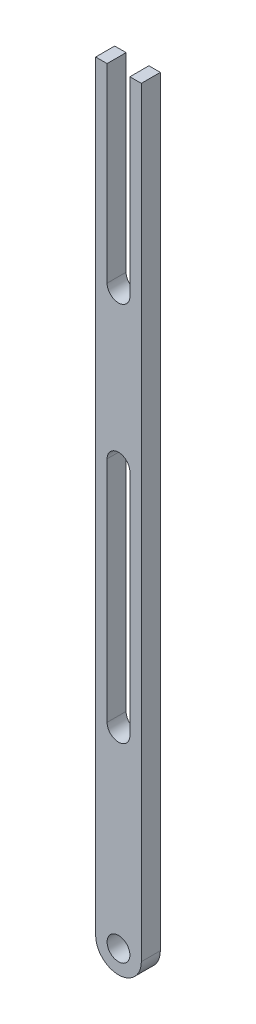
ISO-10303-21;
HEADER;
FILE_DESCRIPTION(('STEP AP214'),'2;1');
FILE_NAME('part.step','',(''),(''),'','','');
FILE_SCHEMA(('AUTOMOTIVE_DESIGN { 1 0 10303 214 1 1 1 1 }'));
ENDSEC;
DATA;
#1=APPLICATION_CONTEXT('core data for automotive mechanical design processes');
#2=APPLICATION_PROTOCOL_DEFINITION('international standard','automotive_design',2000,#1);
#3=PRODUCT_CONTEXT('',#1,'mechanical');
#4=PRODUCT('Part','Part','',(#3));
#5=PRODUCT_RELATED_PRODUCT_CATEGORY('part','',(#4));
#6=PRODUCT_DEFINITION_FORMATION('','',#4);
#7=PRODUCT_DEFINITION_CONTEXT('part definition',#1,'design');
#8=PRODUCT_DEFINITION('design','',#6,#7);
#9=PRODUCT_DEFINITION_SHAPE('','',#8);
#10=(LENGTH_UNIT() NAMED_UNIT(*) SI_UNIT(.MILLI.,.METRE.));
#11=(NAMED_UNIT(*) PLANE_ANGLE_UNIT() SI_UNIT($,.RADIAN.));
#12=(NAMED_UNIT(*) SI_UNIT($,.STERADIAN.) SOLID_ANGLE_UNIT());
#13=UNCERTAINTY_MEASURE_WITH_UNIT(LENGTH_MEASURE(1.E-05),#10,'distance_accuracy_value','');
#14=(GEOMETRIC_REPRESENTATION_CONTEXT(3) GLOBAL_UNCERTAINTY_ASSIGNED_CONTEXT((#13)) GLOBAL_UNIT_ASSIGNED_CONTEXT((#10,
#11,#12)) REPRESENTATION_CONTEXT('',''));
#15=CARTESIAN_POINT('',(0.,0.,0.));
#16=DIRECTION('',(0.,0.,1.));
#17=DIRECTION('',(1.,0.,0.));
#18=AXIS2_PLACEMENT_3D('',#15,#16,#17);
#19=CARTESIAN_POINT('',(-0.599999999999999,192.,5.));
#20=DIRECTION('',(0.,-1.,0.));
#21=DIRECTION('',(0.,0.,-1.));
#22=AXIS2_PLACEMENT_3D('',#19,#20,#21);
#23=PLANE('',#22);
#24=DIRECTION('',(-1.,0.,0.));
#25=VECTOR('',#24,1.);
#26=CARTESIAN_POINT('',(-0.599999999999999,192.,0.));
#27=LINE('',#26,#25);
#28=CARTESIAN_POINT('',(11.4,192.,0.));
#29=VERTEX_POINT('',#28);
#30=CARTESIAN_POINT('',(8.4,192.,0.));
#31=VERTEX_POINT('',#30);
#32=EDGE_CURVE('E157',#29,#31,#27,.T.);
#33=ORIENTED_EDGE('',*,*,#32,.T.);
#34=DIRECTION('',(0.,0.,1.));
#35=VECTOR('',#34,1.);
#36=CARTESIAN_POINT('',(8.4,192.,0.));
#37=LINE('',#36,#35);
#38=CARTESIAN_POINT('',(8.4,192.,5.));
#39=VERTEX_POINT('',#38);
#40=EDGE_CURVE('E203',#31,#39,#37,.T.);
#41=ORIENTED_EDGE('',*,*,#40,.T.);
#42=DIRECTION('',(-1.,0.,0.));
#43=VECTOR('',#42,1.);
#44=CARTESIAN_POINT('',(-0.599999999999999,192.,5.));
#45=LINE('',#44,#43);
#46=CARTESIAN_POINT('',(11.4,192.,5.));
#47=VERTEX_POINT('',#46);
#48=EDGE_CURVE('E185',#47,#39,#45,.T.);
#49=ORIENTED_EDGE('',*,*,#48,.F.);
#50=DIRECTION('',(0.,0.,-1.));
#51=VECTOR('',#50,1.);
#52=CARTESIAN_POINT('',(11.4,192.,5.));
#53=LINE('',#52,#51);
#54=EDGE_CURVE('E48',#47,#29,#53,.T.);
#55=ORIENTED_EDGE('',*,*,#54,.T.);
#56=EDGE_LOOP('',(#33,#41,#49,#55));
#57=FACE_BOUND('',#56,.T.);
#58=ADVANCED_FACE('F39',(#57),#23,.F.);
#59=CARTESIAN_POINT('',(5.4,-8.,5.));
#60=DIRECTION('',(0.,0.,-1.));
#61=DIRECTION('',(-1.,0.,0.));
#62=AXIS2_PLACEMENT_3D('',#59,#60,#61);
#63=CYLINDRICAL_SURFACE('',#62,6.);
#64=CARTESIAN_POINT('',(5.4,-8.,0.));
#65=DIRECTION('',(0.,0.,1.));
#66=DIRECTION('',(-1.,0.,0.));
#67=AXIS2_PLACEMENT_3D('',#64,#65,#66);
#68=CIRCLE('',#67,6.);
#69=CARTESIAN_POINT('',(-0.599999999999999,-8.,0.));
#70=VERTEX_POINT('',#69);
#71=CARTESIAN_POINT('',(11.4,-8.,0.));
#72=VERTEX_POINT('',#71);
#73=EDGE_CURVE('E163',#70,#72,#68,.T.);
#74=ORIENTED_EDGE('',*,*,#73,.T.);
#75=DIRECTION('',(0.,0.,-1.));
#76=VECTOR('',#75,1.);
#77=CARTESIAN_POINT('',(11.4,-8.,5.));
#78=LINE('',#77,#76);
#79=CARTESIAN_POINT('',(11.4,-8.,5.));
#80=VERTEX_POINT('',#79);
#81=EDGE_CURVE('E11',#80,#72,#78,.T.);
#82=ORIENTED_EDGE('',*,*,#81,.F.);
#83=CARTESIAN_POINT('',(5.4,-8.,5.));
#84=DIRECTION('',(0.,0.,1.));
#85=DIRECTION('',(-1.,0.,0.));
#86=AXIS2_PLACEMENT_3D('',#83,#84,#85);
#87=CIRCLE('',#86,6.);
#88=CARTESIAN_POINT('',(-0.599999999999999,-8.,5.));
#89=VERTEX_POINT('',#88);
#90=EDGE_CURVE('E169',#89,#80,#87,.T.);
#91=ORIENTED_EDGE('',*,*,#90,.F.);
#92=DIRECTION('',(0.,0.,-1.));
#93=VECTOR('',#92,1.);
#94=CARTESIAN_POINT('',(-0.599999999999999,-8.,5.));
#95=LINE('',#94,#93);
#96=EDGE_CURVE('E170',#89,#70,#95,.T.);
#97=ORIENTED_EDGE('',*,*,#96,.T.);
#98=EDGE_LOOP('',(#74,#82,#91,#97));
#99=FACE_BOUND('',#98,.T.);
#100=ADVANCED_FACE('F41',(#99),#63,.T.);
#101=CARTESIAN_POINT('',(11.4,192.,5.));
#102=DIRECTION('',(-1.,0.,0.));
#103=DIRECTION('',(0.,-1.,0.));
#104=AXIS2_PLACEMENT_3D('',#101,#102,#103);
#105=PLANE('',#104);
#106=DIRECTION('',(0.,1.,0.));
#107=VECTOR('',#106,1.);
#108=CARTESIAN_POINT('',(11.4,192.,0.));
#109=LINE('',#108,#107);
#110=EDGE_CURVE('E158',#72,#29,#109,.T.);
#111=ORIENTED_EDGE('',*,*,#110,.T.);
#112=ORIENTED_EDGE('',*,*,#54,.F.);
#113=DIRECTION('',(0.,1.,0.));
#114=VECTOR('',#113,1.);
#115=CARTESIAN_POINT('',(11.4,192.,5.));
#116=LINE('',#115,#114);
#117=EDGE_CURVE('E264',#80,#47,#116,.T.);
#118=ORIENTED_EDGE('',*,*,#117,.F.);
#119=ORIENTED_EDGE('',*,*,#81,.T.);
#120=EDGE_LOOP('',(#111,#112,#118,#119));
#121=FACE_BOUND('',#120,.T.);
#122=ADVANCED_FACE('F286',(#121),#105,.F.);
#123=CARTESIAN_POINT('',(2.4,192.,5.));
#124=VERTEX_POINT('',#123);
#125=CARTESIAN_POINT('',(-0.599999999999999,192.,5.));
#126=VERTEX_POINT('',#125);
#127=EDGE_CURVE('E146',#124,#126,#45,.T.);
#128=ORIENTED_EDGE('',*,*,#127,.F.);
#129=DIRECTION('',(0.,0.,1.));
#130=VECTOR('',#129,1.);
#131=CARTESIAN_POINT('',(2.4,192.,0.));
#132=LINE('',#131,#130);
#133=CARTESIAN_POINT('',(2.4,192.,0.));
#134=VERTEX_POINT('',#133);
#135=EDGE_CURVE('E132',#134,#124,#132,.T.);
#136=ORIENTED_EDGE('',*,*,#135,.F.);
#137=CARTESIAN_POINT('',(-0.599999999999999,192.,0.));
#138=VERTEX_POINT('',#137);
#139=EDGE_CURVE('E144',#134,#138,#27,.T.);
#140=ORIENTED_EDGE('',*,*,#139,.T.);
#141=DIRECTION('',(0.,0.,-1.));
#142=VECTOR('',#141,1.);
#143=CARTESIAN_POINT('',(-0.599999999999999,192.,5.));
#144=LINE('',#143,#142);
#145=EDGE_CURVE('E174',#126,#138,#144,.T.);
#146=ORIENTED_EDGE('',*,*,#145,.F.);
#147=EDGE_LOOP('',(#128,#136,#140,#146));
#148=FACE_BOUND('',#147,.T.);
#149=ADVANCED_FACE('F142',(#148),#23,.F.);
#150=CARTESIAN_POINT('',(-0.599999999999999,-8.,5.));
#151=DIRECTION('',(1.,0.,0.));
#152=DIRECTION('',(0.,0.,-1.));
#153=AXIS2_PLACEMENT_3D('',#150,#151,#152);
#154=PLANE('',#153);
#155=DIRECTION('',(0.,-1.,0.));
#156=VECTOR('',#155,1.);
#157=CARTESIAN_POINT('',(-0.599999999999999,-8.,0.));
#158=LINE('',#157,#156);
#159=EDGE_CURVE('E155',#138,#70,#158,.T.);
#160=ORIENTED_EDGE('',*,*,#159,.T.);
#161=ORIENTED_EDGE('',*,*,#96,.F.);
#162=DIRECTION('',(0.,-1.,0.));
#163=VECTOR('',#162,1.);
#164=CARTESIAN_POINT('',(-0.599999999999999,-8.,5.));
#165=LINE('',#164,#163);
#166=EDGE_CURVE('E175',#126,#89,#165,.T.);
#167=ORIENTED_EDGE('',*,*,#166,.F.);
#168=ORIENTED_EDGE('',*,*,#145,.T.);
#169=EDGE_LOOP('',(#160,#161,#167,#168));
#170=FACE_BOUND('',#169,.T.);
#171=ADVANCED_FACE('F278',(#170),#154,.F.);
#172=CARTESIAN_POINT('',(5.4,-8.,5.));
#173=DIRECTION('',(0.,0.,-1.));
#174=DIRECTION('',(-1.,0.,0.));
#175=AXIS2_PLACEMENT_3D('',#172,#173,#174);
#176=PLANE('',#175);
#177=DIRECTION('',(0.,-1.,0.));
#178=VECTOR('',#177,1.);
#179=CARTESIAN_POINT('',(2.4,102.,5.));
#180=LINE('',#179,#178);
#181=CARTESIAN_POINT('',(2.4,102.,5.));
#182=VERTEX_POINT('',#181);
#183=CARTESIAN_POINT('',(2.40000000000001,42.,5.));
#184=VERTEX_POINT('',#183);
#185=EDGE_CURVE('E231',#182,#184,#180,.T.);
#186=ORIENTED_EDGE('',*,*,#185,.F.);
#187=CARTESIAN_POINT('',(5.4,102.,5.));
#188=DIRECTION('',(0.,0.,1.));
#189=DIRECTION('',(1.,0.,0.));
#190=AXIS2_PLACEMENT_3D('',#187,#188,#189);
#191=CIRCLE('',#190,3.);
#192=CARTESIAN_POINT('',(8.4,102.,5.));
#193=VERTEX_POINT('',#192);
#194=EDGE_CURVE('E63',#193,#182,#191,.T.);
#195=ORIENTED_EDGE('',*,*,#194,.F.);
#196=DIRECTION('',(0.,1.,0.));
#197=VECTOR('',#196,1.);
#198=CARTESIAN_POINT('',(8.4,42.,5.));
#199=LINE('',#198,#197);
#200=CARTESIAN_POINT('',(8.4,42.,5.));
#201=VERTEX_POINT('',#200);
#202=EDGE_CURVE('E216',#201,#193,#199,.T.);
#203=ORIENTED_EDGE('',*,*,#202,.F.);
#204=CARTESIAN_POINT('',(5.4,42.,5.));
#205=DIRECTION('',(0.,0.,1.));
#206=DIRECTION('',(1.,0.,0.));
#207=AXIS2_PLACEMENT_3D('',#204,#205,#206);
#208=CIRCLE('',#207,3.);
#209=EDGE_CURVE('E235',#184,#201,#208,.T.);
#210=ORIENTED_EDGE('',*,*,#209,.F.);
#211=EDGE_LOOP('',(#186,#195,#203,#210));
#212=FACE_BOUND('',#211,.T.);
#213=CARTESIAN_POINT('',(5.4,-8.,5.));
#214=DIRECTION('',(0.,0.,1.));
#215=DIRECTION('',(1.,0.,0.));
#216=AXIS2_PLACEMENT_3D('',#213,#214,#215);
#217=CIRCLE('',#216,3.);
#218=CARTESIAN_POINT('',(8.4,-8.,5.));
#219=VERTEX_POINT('',#218);
#220=EDGE_CURVE('E245',#219,#219,#217,.T.);
#221=ORIENTED_EDGE('',*,*,#220,.F.);
#222=EDGE_LOOP('',(#221));
#223=FACE_BOUND('',#222,.T.);
#224=ORIENTED_EDGE('',*,*,#48,.T.);
#225=DIRECTION('',(0.,1.,0.));
#226=VECTOR('',#225,1.);
#227=CARTESIAN_POINT('',(8.4,142.,5.));
#228=LINE('',#227,#226);
#229=CARTESIAN_POINT('',(8.4,142.,5.));
#230=VERTEX_POINT('',#229);
#231=EDGE_CURVE('E138',#230,#39,#228,.T.);
#232=ORIENTED_EDGE('',*,*,#231,.F.);
#233=CARTESIAN_POINT('',(5.4,142.,5.));
#234=DIRECTION('',(0.,0.,1.));
#235=DIRECTION('',(-1.,0.,0.));
#236=AXIS2_PLACEMENT_3D('',#233,#234,#235);
#237=CIRCLE('',#236,3.);
#238=CARTESIAN_POINT('',(2.4,142.,5.));
#239=VERTEX_POINT('',#238);
#240=EDGE_CURVE('E197',#239,#230,#237,.T.);
#241=ORIENTED_EDGE('',*,*,#240,.F.);
#242=DIRECTION('',(0.,-1.,0.));
#243=VECTOR('',#242,1.);
#244=CARTESIAN_POINT('',(2.4,192.,5.));
#245=LINE('',#244,#243);
#246=EDGE_CURVE('E194',#124,#239,#245,.T.);
#247=ORIENTED_EDGE('',*,*,#246,.F.);
#248=ORIENTED_EDGE('',*,*,#127,.T.);
#249=ORIENTED_EDGE('',*,*,#166,.T.);
#250=ORIENTED_EDGE('',*,*,#90,.T.);
#251=ORIENTED_EDGE('',*,*,#117,.T.);
#252=EDGE_LOOP('',(#224,#232,#241,#247,#248,#249,#250,#251));
#253=FACE_BOUND('',#252,.T.);
#254=ADVANCED_FACE('F280',(#212,#223,#253),#176,.F.);
#255=CARTESIAN_POINT('',(5.4,-8.,0.));
#256=DIRECTION('',(0.,0.,-1.));
#257=DIRECTION('',(-1.,0.,0.));
#258=AXIS2_PLACEMENT_3D('',#255,#256,#257);
#259=PLANE('',#258);
#260=DIRECTION('',(0.,1.,0.));
#261=VECTOR('',#260,1.);
#262=CARTESIAN_POINT('',(8.4,142.,0.));
#263=LINE('',#262,#261);
#264=CARTESIAN_POINT('',(8.4,142.,0.));
#265=VERTEX_POINT('',#264);
#266=EDGE_CURVE('E148',#265,#31,#263,.T.);
#267=ORIENTED_EDGE('',*,*,#266,.T.);
#268=ORIENTED_EDGE('',*,*,#32,.F.);
#269=ORIENTED_EDGE('',*,*,#110,.F.);
#270=ORIENTED_EDGE('',*,*,#73,.F.);
#271=ORIENTED_EDGE('',*,*,#159,.F.);
#272=ORIENTED_EDGE('',*,*,#139,.F.);
#273=DIRECTION('',(0.,-1.,0.));
#274=VECTOR('',#273,1.);
#275=CARTESIAN_POINT('',(2.4,192.,0.));
#276=LINE('',#275,#274);
#277=CARTESIAN_POINT('',(2.4,142.,0.));
#278=VERTEX_POINT('',#277);
#279=EDGE_CURVE('E128',#134,#278,#276,.T.);
#280=ORIENTED_EDGE('',*,*,#279,.T.);
#281=CARTESIAN_POINT('',(5.4,142.,0.));
#282=DIRECTION('',(0.,0.,1.));
#283=DIRECTION('',(-1.,0.,0.));
#284=AXIS2_PLACEMENT_3D('',#281,#282,#283);
#285=CIRCLE('',#284,3.);
#286=EDGE_CURVE('E55',#278,#265,#285,.T.);
#287=ORIENTED_EDGE('',*,*,#286,.T.);
#288=EDGE_LOOP('',(#267,#268,#269,#270,#271,#272,#280,#287));
#289=FACE_BOUND('',#288,.T.);
#290=CARTESIAN_POINT('',(5.4,102.,0.));
#291=DIRECTION('',(0.,0.,1.));
#292=DIRECTION('',(1.,0.,0.));
#293=AXIS2_PLACEMENT_3D('',#290,#291,#292);
#294=CIRCLE('',#293,3.);
#295=CARTESIAN_POINT('',(8.4,102.,0.));
#296=VERTEX_POINT('',#295);
#297=CARTESIAN_POINT('',(2.4,102.,0.));
#298=VERTEX_POINT('',#297);
#299=EDGE_CURVE('E211',#296,#298,#294,.T.);
#300=ORIENTED_EDGE('',*,*,#299,.T.);
#301=DIRECTION('',(0.,-1.,0.));
#302=VECTOR('',#301,1.);
#303=CARTESIAN_POINT('',(2.4,102.,0.));
#304=LINE('',#303,#302);
#305=CARTESIAN_POINT('',(2.40000000000001,42.,0.));
#306=VERTEX_POINT('',#305);
#307=EDGE_CURVE('E215',#298,#306,#304,.T.);
#308=ORIENTED_EDGE('',*,*,#307,.T.);
#309=CARTESIAN_POINT('',(5.4,42.,0.));
#310=DIRECTION('',(0.,0.,1.));
#311=DIRECTION('',(1.,0.,0.));
#312=AXIS2_PLACEMENT_3D('',#309,#310,#311);
#313=CIRCLE('',#312,3.);
#314=CARTESIAN_POINT('',(8.4,42.,0.));
#315=VERTEX_POINT('',#314);
#316=EDGE_CURVE('E220',#306,#315,#313,.T.);
#317=ORIENTED_EDGE('',*,*,#316,.T.);
#318=DIRECTION('',(0.,1.,0.));
#319=VECTOR('',#318,1.);
#320=CARTESIAN_POINT('',(8.4,42.,0.));
#321=LINE('',#320,#319);
#322=EDGE_CURVE('E224',#315,#296,#321,.T.);
#323=ORIENTED_EDGE('',*,*,#322,.T.);
#324=EDGE_LOOP('',(#300,#308,#317,#323));
#325=FACE_BOUND('',#324,.T.);
#326=CARTESIAN_POINT('',(5.4,-8.,0.));
#327=DIRECTION('',(0.,0.,1.));
#328=DIRECTION('',(1.,0.,0.));
#329=AXIS2_PLACEMENT_3D('',#326,#327,#328);
#330=CIRCLE('',#329,3.);
#331=CARTESIAN_POINT('',(8.4,-8.,0.));
#332=VERTEX_POINT('',#331);
#333=EDGE_CURVE('E254',#332,#332,#330,.T.);
#334=ORIENTED_EDGE('',*,*,#333,.T.);
#335=EDGE_LOOP('',(#334));
#336=FACE_BOUND('',#335,.T.);
#337=ADVANCED_FACE('F152',(#289,#325,#336),#259,.T.);
#338=CARTESIAN_POINT('',(5.4,-8.,0.));
#339=DIRECTION('',(0.,0.,1.));
#340=DIRECTION('',(1.,0.,0.));
#341=AXIS2_PLACEMENT_3D('',#338,#339,#340);
#342=CYLINDRICAL_SURFACE('',#341,3.);
#343=ORIENTED_EDGE('',*,*,#333,.F.);
#344=EDGE_LOOP('',(#343));
#345=FACE_BOUND('',#344,.T.);
#346=ORIENTED_EDGE('',*,*,#220,.T.);
#347=EDGE_LOOP('',(#346));
#348=FACE_BOUND('',#347,.T.);
#349=ADVANCED_FACE('F301',(#345,#348),#342,.F.);
#350=CARTESIAN_POINT('',(5.4,102.,0.));
#351=DIRECTION('',(0.,0.,1.));
#352=DIRECTION('',(1.,0.,0.));
#353=AXIS2_PLACEMENT_3D('',#350,#351,#352);
#354=CYLINDRICAL_SURFACE('',#353,3.);
#355=ORIENTED_EDGE('',*,*,#194,.T.);
#356=DIRECTION('',(0.,0.,1.));
#357=VECTOR('',#356,1.);
#358=CARTESIAN_POINT('',(2.4,102.,0.));
#359=LINE('',#358,#357);
#360=EDGE_CURVE('E228',#298,#182,#359,.T.);
#361=ORIENTED_EDGE('',*,*,#360,.F.);
#362=ORIENTED_EDGE('',*,*,#299,.F.);
#363=DIRECTION('',(0.,0.,1.));
#364=VECTOR('',#363,1.);
#365=CARTESIAN_POINT('',(8.4,102.,0.));
#366=LINE('',#365,#364);
#367=EDGE_CURVE('E242',#296,#193,#366,.T.);
#368=ORIENTED_EDGE('',*,*,#367,.T.);
#369=EDGE_LOOP('',(#355,#361,#362,#368));
#370=FACE_BOUND('',#369,.T.);
#371=ADVANCED_FACE('F307',(#370),#354,.F.);
#372=CARTESIAN_POINT('',(8.4,42.,0.));
#373=DIRECTION('',(1.,0.,0.));
#374=DIRECTION('',(0.,0.,-1.));
#375=AXIS2_PLACEMENT_3D('',#372,#373,#374);
#376=PLANE('',#375);
#377=ORIENTED_EDGE('',*,*,#202,.T.);
#378=ORIENTED_EDGE('',*,*,#367,.F.);
#379=ORIENTED_EDGE('',*,*,#322,.F.);
#380=DIRECTION('',(0.,0.,1.));
#381=VECTOR('',#380,1.);
#382=CARTESIAN_POINT('',(8.4,42.,0.));
#383=LINE('',#382,#381);
#384=EDGE_CURVE('E246',#315,#201,#383,.T.);
#385=ORIENTED_EDGE('',*,*,#384,.T.);
#386=EDGE_LOOP('',(#377,#378,#379,#385));
#387=FACE_BOUND('',#386,.T.);
#388=ADVANCED_FACE('F311',(#387),#376,.F.);
#389=CARTESIAN_POINT('',(5.4,42.,0.));
#390=DIRECTION('',(0.,0.,1.));
#391=DIRECTION('',(1.,0.,0.));
#392=AXIS2_PLACEMENT_3D('',#389,#390,#391);
#393=CYLINDRICAL_SURFACE('',#392,3.);
#394=ORIENTED_EDGE('',*,*,#209,.T.);
#395=ORIENTED_EDGE('',*,*,#384,.F.);
#396=ORIENTED_EDGE('',*,*,#316,.F.);
#397=DIRECTION('',(0.,0.,1.));
#398=VECTOR('',#397,1.);
#399=CARTESIAN_POINT('',(2.40000000000001,42.,0.));
#400=LINE('',#399,#398);
#401=EDGE_CURVE('E249',#306,#184,#400,.T.);
#402=ORIENTED_EDGE('',*,*,#401,.T.);
#403=EDGE_LOOP('',(#394,#395,#396,#402));
#404=FACE_BOUND('',#403,.T.);
#405=ADVANCED_FACE('F315',(#404),#393,.F.);
#406=CARTESIAN_POINT('',(2.4,102.,0.));
#407=DIRECTION('',(-1.,0.,0.));
#408=DIRECTION('',(0.,-1.,0.));
#409=AXIS2_PLACEMENT_3D('',#406,#407,#408);
#410=PLANE('',#409);
#411=ORIENTED_EDGE('',*,*,#185,.T.);
#412=ORIENTED_EDGE('',*,*,#401,.F.);
#413=ORIENTED_EDGE('',*,*,#307,.F.);
#414=ORIENTED_EDGE('',*,*,#360,.T.);
#415=EDGE_LOOP('',(#411,#412,#413,#414));
#416=FACE_BOUND('',#415,.T.);
#417=ADVANCED_FACE('F312',(#416),#410,.F.);
#418=CARTESIAN_POINT('',(8.4,142.,0.));
#419=DIRECTION('',(1.,0.,0.));
#420=DIRECTION('',(0.,0.,-1.));
#421=AXIS2_PLACEMENT_3D('',#418,#419,#420);
#422=PLANE('',#421);
#423=ORIENTED_EDGE('',*,*,#231,.T.);
#424=ORIENTED_EDGE('',*,*,#40,.F.);
#425=ORIENTED_EDGE('',*,*,#266,.F.);
#426=DIRECTION('',(0.,0.,1.));
#427=VECTOR('',#426,1.);
#428=CARTESIAN_POINT('',(8.4,142.,0.));
#429=LINE('',#428,#427);
#430=EDGE_CURVE('E206',#265,#230,#429,.T.);
#431=ORIENTED_EDGE('',*,*,#430,.T.);
#432=EDGE_LOOP('',(#423,#424,#425,#431));
#433=FACE_BOUND('',#432,.T.);
#434=ADVANCED_FACE('F285',(#433),#422,.F.);
#435=CARTESIAN_POINT('',(5.4,142.,0.));
#436=DIRECTION('',(0.,0.,1.));
#437=DIRECTION('',(1.,0.,0.));
#438=AXIS2_PLACEMENT_3D('',#435,#436,#437);
#439=CYLINDRICAL_SURFACE('',#438,3.);
#440=ORIENTED_EDGE('',*,*,#240,.T.);
#441=ORIENTED_EDGE('',*,*,#430,.F.);
#442=ORIENTED_EDGE('',*,*,#286,.F.);
#443=DIRECTION('',(0.,0.,1.));
#444=VECTOR('',#443,1.);
#445=CARTESIAN_POINT('',(2.4,142.,0.));
#446=LINE('',#445,#444);
#447=EDGE_CURVE('E134',#278,#239,#446,.T.);
#448=ORIENTED_EDGE('',*,*,#447,.T.);
#449=EDGE_LOOP('',(#440,#441,#442,#448));
#450=FACE_BOUND('',#449,.T.);
#451=ADVANCED_FACE('F284',(#450),#439,.F.);
#452=CARTESIAN_POINT('',(2.4,192.,0.));
#453=DIRECTION('',(-1.,0.,0.));
#454=DIRECTION('',(0.,0.,1.));
#455=AXIS2_PLACEMENT_3D('',#452,#453,#454);
#456=PLANE('',#455);
#457=ORIENTED_EDGE('',*,*,#246,.T.);
#458=ORIENTED_EDGE('',*,*,#447,.F.);
#459=ORIENTED_EDGE('',*,*,#279,.F.);
#460=ORIENTED_EDGE('',*,*,#135,.T.);
#461=EDGE_LOOP('',(#457,#458,#459,#460));
#462=FACE_BOUND('',#461,.T.);
#463=ADVANCED_FACE('F131',(#462),#456,.F.);
#464=CLOSED_SHELL('',(#58,#100,#122,#149,#171,#254,#337,#349,#371,#388,#405,#417,#434,#451,#463));
#465=MANIFOLD_SOLID_BREP('B2',#464);
#466=ADVANCED_BREP_SHAPE_REPRESENTATION('',(#18,#465),#14);
#467=SHAPE_DEFINITION_REPRESENTATION(#9,#466);
ENDSEC;
END-ISO-10303-21;
